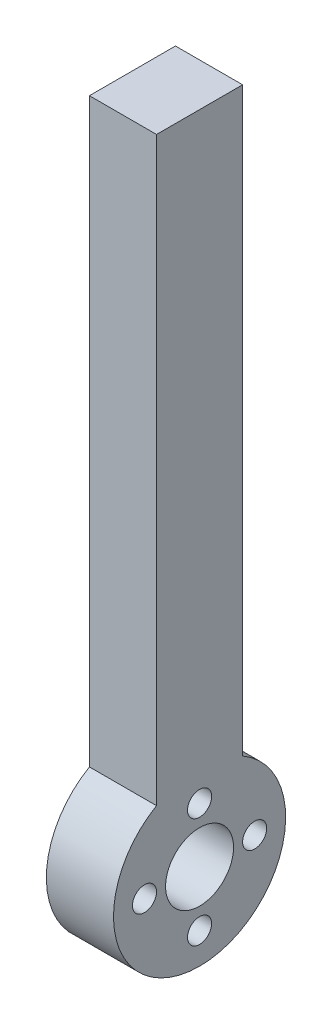
ISO-10303-21;
HEADER;
FILE_DESCRIPTION(('STEP AP214'),'2;1');
FILE_NAME('part.step','',(''),(''),'','','');
FILE_SCHEMA(('AUTOMOTIVE_DESIGN { 1 0 10303 214 1 1 1 1 }'));
ENDSEC;
DATA;
#1=APPLICATION_CONTEXT('core data for automotive mechanical design processes');
#2=APPLICATION_PROTOCOL_DEFINITION('international standard','automotive_design',2000,#1);
#3=PRODUCT_CONTEXT('',#1,'mechanical');
#4=PRODUCT('Part','Part','',(#3));
#5=PRODUCT_RELATED_PRODUCT_CATEGORY('part','',(#4));
#6=PRODUCT_DEFINITION_FORMATION('','',#4);
#7=PRODUCT_DEFINITION_CONTEXT('part definition',#1,'design');
#8=PRODUCT_DEFINITION('design','',#6,#7);
#9=PRODUCT_DEFINITION_SHAPE('','',#8);
#10=(LENGTH_UNIT() NAMED_UNIT(*) SI_UNIT(.MILLI.,.METRE.));
#11=(NAMED_UNIT(*) PLANE_ANGLE_UNIT() SI_UNIT($,.RADIAN.));
#12=(NAMED_UNIT(*) SI_UNIT($,.STERADIAN.) SOLID_ANGLE_UNIT());
#13=UNCERTAINTY_MEASURE_WITH_UNIT(LENGTH_MEASURE(1.E-05),#10,'distance_accuracy_value','');
#14=(GEOMETRIC_REPRESENTATION_CONTEXT(3) GLOBAL_UNCERTAINTY_ASSIGNED_CONTEXT((#13)) GLOBAL_UNIT_ASSIGNED_CONTEXT((#10,
#11,#12)) REPRESENTATION_CONTEXT('',''));
#15=CARTESIAN_POINT('',(0.,0.,0.));
#16=DIRECTION('',(0.,0.,1.));
#17=DIRECTION('',(1.,0.,0.));
#18=AXIS2_PLACEMENT_3D('',#15,#16,#17);
#19=CARTESIAN_POINT('',(9.906,-45.9740000480624,0.));
#20=DIRECTION('',(1.,0.,0.));
#21=DIRECTION('',(0.,0.,-1.));
#22=AXIS2_PLACEMENT_3D('',#19,#20,#21);
#23=PLANE('',#22);
#24=CARTESIAN_POINT('',(9.906,-45.9740000480624,-8.128));
#25=DIRECTION('',(1.,0.,0.));
#26=DIRECTION('',(0.,0.,-1.));
#27=AXIS2_PLACEMENT_3D('',#24,#25,#26);
#28=CIRCLE('',#27,1.778);
#29=CARTESIAN_POINT('',(9.906,-45.9740000480624,-9.90600000000001));
#30=VERTEX_POINT('',#29);
#31=EDGE_CURVE('E130',#30,#30,#28,.T.);
#32=ORIENTED_EDGE('',*,*,#31,.F.);
#33=EDGE_LOOP('',(#32));
#34=FACE_BOUND('',#33,.T.);
#35=CARTESIAN_POINT('',(9.906,-45.9740000480624,8.128));
#36=DIRECTION('',(1.,0.,0.));
#37=DIRECTION('',(0.,0.,-1.));
#38=AXIS2_PLACEMENT_3D('',#35,#36,#37);
#39=CIRCLE('',#38,1.778);
#40=CARTESIAN_POINT('',(9.906,-45.9740000480624,6.35));
#41=VERTEX_POINT('',#40);
#42=EDGE_CURVE('E118',#41,#41,#39,.T.);
#43=ORIENTED_EDGE('',*,*,#42,.F.);
#44=EDGE_LOOP('',(#43));
#45=FACE_BOUND('',#44,.T.);
#46=DIRECTION('',(0.,1.,0.));
#47=VECTOR('',#46,1.);
#48=CARTESIAN_POINT('',(9.906,-34.97547742,-6.35));
#49=LINE('',#48,#47);
#50=CARTESIAN_POINT('',(9.906,-34.97547742,-6.35000000000001));
#51=VERTEX_POINT('',#50);
#52=CARTESIAN_POINT('',(9.906,50.8,-6.35));
#53=VERTEX_POINT('',#52);
#54=EDGE_CURVE('E88',#51,#53,#49,.T.);
#55=ORIENTED_EDGE('',*,*,#54,.T.);
#56=DIRECTION('',(0.,0.,1.));
#57=VECTOR('',#56,1.);
#58=CARTESIAN_POINT('',(9.906,50.8,6.35));
#59=LINE('',#58,#57);
#60=CARTESIAN_POINT('',(9.906,50.8,6.35));
#61=VERTEX_POINT('',#60);
#62=EDGE_CURVE('E83',#53,#61,#59,.T.);
#63=ORIENTED_EDGE('',*,*,#62,.T.);
#64=DIRECTION('',(0.,-1.,0.));
#65=VECTOR('',#64,1.);
#66=CARTESIAN_POINT('',(9.906,-34.97547742,6.35));
#67=LINE('',#66,#65);
#68=CARTESIAN_POINT('',(9.906,-34.97547742,6.35));
#69=VERTEX_POINT('',#68);
#70=EDGE_CURVE('E86',#61,#69,#67,.T.);
#71=ORIENTED_EDGE('',*,*,#70,.T.);
#72=CARTESIAN_POINT('',(9.906,-45.9740000480624,0.));
#73=DIRECTION('',(1.,0.,0.));
#74=DIRECTION('',(0.,0.,-1.));
#75=AXIS2_PLACEMENT_3D('',#72,#73,#74);
#76=CIRCLE('',#75,12.7);
#77=EDGE_CURVE('E53',#69,#51,#76,.T.);
#78=ORIENTED_EDGE('',*,*,#77,.T.);
#79=EDGE_LOOP('',(#55,#63,#71,#78));
#80=FACE_BOUND('',#79,.T.);
#81=CARTESIAN_POINT('',(9.906,-45.9740000480624,0.));
#82=DIRECTION('',(1.,0.,0.));
#83=DIRECTION('',(0.,0.,-1.));
#84=AXIS2_PLACEMENT_3D('',#81,#82,#83);
#85=CIRCLE('',#84,5.0165);
#86=CARTESIAN_POINT('',(9.906,-45.9740000480624,-5.0165));
#87=VERTEX_POINT('',#86);
#88=EDGE_CURVE('E103',#87,#87,#85,.T.);
#89=ORIENTED_EDGE('',*,*,#88,.F.);
#90=EDGE_LOOP('',(#89));
#91=FACE_BOUND('',#90,.T.);
#92=CARTESIAN_POINT('',(9.906,-37.8460000480624,0.));
#93=DIRECTION('',(1.,0.,0.));
#94=DIRECTION('',(0.,0.,-1.));
#95=AXIS2_PLACEMENT_3D('',#92,#93,#94);
#96=CIRCLE('',#95,1.77800000000001);
#97=CARTESIAN_POINT('',(9.906,-37.8460000480624,-1.77800000000001));
#98=VERTEX_POINT('',#97);
#99=EDGE_CURVE('E124',#98,#98,#96,.T.);
#100=ORIENTED_EDGE('',*,*,#99,.F.);
#101=EDGE_LOOP('',(#100));
#102=FACE_BOUND('',#101,.T.);
#103=CARTESIAN_POINT('',(9.906,-54.1020000480624,0.));
#104=DIRECTION('',(1.,0.,0.));
#105=DIRECTION('',(0.,0.,-1.));
#106=AXIS2_PLACEMENT_3D('',#103,#104,#105);
#107=CIRCLE('',#106,1.778);
#108=CARTESIAN_POINT('',(9.906,-54.1020000480624,-1.77800000000001));
#109=VERTEX_POINT('',#108);
#110=EDGE_CURVE('E136',#109,#109,#107,.T.);
#111=ORIENTED_EDGE('',*,*,#110,.F.);
#112=EDGE_LOOP('',(#111));
#113=FACE_BOUND('',#112,.T.);
#114=ADVANCED_FACE('F36',(#34,#45,#80,#91,#102,#113),#23,.T.);
#115=CARTESIAN_POINT('',(0.,-45.9740000480624,0.));
#116=DIRECTION('',(1.,0.,0.));
#117=DIRECTION('',(0.,0.,-1.));
#118=AXIS2_PLACEMENT_3D('',#115,#116,#117);
#119=PLANE('',#118);
#120=DIRECTION('',(0.,1.,0.));
#121=VECTOR('',#120,1.);
#122=CARTESIAN_POINT('',(0.,-34.97547742,-6.35));
#123=LINE('',#122,#121);
#124=CARTESIAN_POINT('',(0.,-34.97547742,-6.35000000000001));
#125=VERTEX_POINT('',#124);
#126=CARTESIAN_POINT('',(0.,50.8,-6.35));
#127=VERTEX_POINT('',#126);
#128=EDGE_CURVE('E100',#125,#127,#123,.T.);
#129=ORIENTED_EDGE('',*,*,#128,.F.);
#130=CARTESIAN_POINT('',(0.,-45.9740000480624,0.));
#131=DIRECTION('',(1.,0.,0.));
#132=DIRECTION('',(0.,0.,-1.));
#133=AXIS2_PLACEMENT_3D('',#130,#131,#132);
#134=CIRCLE('',#133,12.7);
#135=CARTESIAN_POINT('',(0.,-34.97547742,6.35));
#136=VERTEX_POINT('',#135);
#137=EDGE_CURVE('E76',#136,#125,#134,.T.);
#138=ORIENTED_EDGE('',*,*,#137,.F.);
#139=DIRECTION('',(0.,-1.,0.));
#140=VECTOR('',#139,1.);
#141=CARTESIAN_POINT('',(0.,-34.97547742,6.35));
#142=LINE('',#141,#140);
#143=CARTESIAN_POINT('',(0.,50.8,6.35));
#144=VERTEX_POINT('',#143);
#145=EDGE_CURVE('E70',#144,#136,#142,.T.);
#146=ORIENTED_EDGE('',*,*,#145,.F.);
#147=DIRECTION('',(0.,0.,1.));
#148=VECTOR('',#147,1.);
#149=CARTESIAN_POINT('',(0.,50.8,6.35));
#150=LINE('',#149,#148);
#151=EDGE_CURVE('E92',#127,#144,#150,.T.);
#152=ORIENTED_EDGE('',*,*,#151,.F.);
#153=EDGE_LOOP('',(#129,#138,#146,#152));
#154=FACE_BOUND('',#153,.T.);
#155=CARTESIAN_POINT('',(0.,-45.9740000480624,0.));
#156=DIRECTION('',(1.,0.,0.));
#157=DIRECTION('',(0.,0.,-1.));
#158=AXIS2_PLACEMENT_3D('',#155,#156,#157);
#159=CIRCLE('',#158,5.0165);
#160=CARTESIAN_POINT('',(0.,-45.9740000480624,-5.0165));
#161=VERTEX_POINT('',#160);
#162=EDGE_CURVE('E115',#161,#161,#159,.T.);
#163=ORIENTED_EDGE('',*,*,#162,.T.);
#164=EDGE_LOOP('',(#163));
#165=FACE_BOUND('',#164,.T.);
#166=CARTESIAN_POINT('',(0.,-45.9740000480624,8.128));
#167=DIRECTION('',(1.,0.,0.));
#168=DIRECTION('',(0.,0.,-1.));
#169=AXIS2_PLACEMENT_3D('',#166,#167,#168);
#170=CIRCLE('',#169,1.778);
#171=CARTESIAN_POINT('',(0.,-45.9740000480624,6.35));
#172=VERTEX_POINT('',#171);
#173=EDGE_CURVE('E121',#172,#172,#170,.T.);
#174=ORIENTED_EDGE('',*,*,#173,.T.);
#175=EDGE_LOOP('',(#174));
#176=FACE_BOUND('',#175,.T.);
#177=CARTESIAN_POINT('',(0.,-37.8460000480624,0.));
#178=DIRECTION('',(1.,0.,0.));
#179=DIRECTION('',(0.,0.,-1.));
#180=AXIS2_PLACEMENT_3D('',#177,#178,#179);
#181=CIRCLE('',#180,1.77800000000001);
#182=CARTESIAN_POINT('',(0.,-37.8460000480624,-1.77800000000001));
#183=VERTEX_POINT('',#182);
#184=EDGE_CURVE('E127',#183,#183,#181,.T.);
#185=ORIENTED_EDGE('',*,*,#184,.T.);
#186=EDGE_LOOP('',(#185));
#187=FACE_BOUND('',#186,.T.);
#188=CARTESIAN_POINT('',(0.,-45.9740000480624,-8.128));
#189=DIRECTION('',(1.,0.,0.));
#190=DIRECTION('',(0.,0.,-1.));
#191=AXIS2_PLACEMENT_3D('',#188,#189,#190);
#192=CIRCLE('',#191,1.778);
#193=CARTESIAN_POINT('',(0.,-45.9740000480624,-9.90600000000001));
#194=VERTEX_POINT('',#193);
#195=EDGE_CURVE('E133',#194,#194,#192,.T.);
#196=ORIENTED_EDGE('',*,*,#195,.T.);
#197=EDGE_LOOP('',(#196));
#198=FACE_BOUND('',#197,.T.);
#199=CARTESIAN_POINT('',(0.,-54.1020000480624,0.));
#200=DIRECTION('',(1.,0.,0.));
#201=DIRECTION('',(0.,0.,-1.));
#202=AXIS2_PLACEMENT_3D('',#199,#200,#201);
#203=CIRCLE('',#202,1.778);
#204=CARTESIAN_POINT('',(0.,-54.1020000480624,-1.77800000000001));
#205=VERTEX_POINT('',#204);
#206=EDGE_CURVE('E139',#205,#205,#203,.T.);
#207=ORIENTED_EDGE('',*,*,#206,.T.);
#208=EDGE_LOOP('',(#207));
#209=FACE_BOUND('',#208,.T.);
#210=ADVANCED_FACE('F111',(#154,#165,#176,#187,#198,#209),#119,.F.);
#211=CARTESIAN_POINT('',(9.906,-34.97547742,-6.35));
#212=DIRECTION('',(0.,0.,1.));
#213=DIRECTION('',(0.,-1.,0.));
#214=AXIS2_PLACEMENT_3D('',#211,#212,#213);
#215=PLANE('',#214);
#216=ORIENTED_EDGE('',*,*,#128,.T.);
#217=DIRECTION('',(-1.,0.,0.));
#218=VECTOR('',#217,1.);
#219=CARTESIAN_POINT('',(9.906,50.8,-6.35));
#220=LINE('',#219,#218);
#221=EDGE_CURVE('E11',#53,#127,#220,.T.);
#222=ORIENTED_EDGE('',*,*,#221,.F.);
#223=ORIENTED_EDGE('',*,*,#54,.F.);
#224=DIRECTION('',(-1.,0.,0.));
#225=VECTOR('',#224,1.);
#226=CARTESIAN_POINT('',(9.906,-34.97547742,-6.35000000000001));
#227=LINE('',#226,#225);
#228=EDGE_CURVE('E96',#51,#125,#227,.T.);
#229=ORIENTED_EDGE('',*,*,#228,.T.);
#230=EDGE_LOOP('',(#216,#222,#223,#229));
#231=FACE_BOUND('',#230,.T.);
#232=ADVANCED_FACE('F38',(#231),#215,.F.);
#233=CARTESIAN_POINT('',(9.906,50.8,6.35));
#234=DIRECTION('',(0.,-1.,0.));
#235=DIRECTION('',(0.,0.,-1.));
#236=AXIS2_PLACEMENT_3D('',#233,#234,#235);
#237=PLANE('',#236);
#238=ORIENTED_EDGE('',*,*,#151,.T.);
#239=DIRECTION('',(-1.,0.,0.));
#240=VECTOR('',#239,1.);
#241=CARTESIAN_POINT('',(9.906,50.8,6.35));
#242=LINE('',#241,#240);
#243=EDGE_CURVE('E45',#61,#144,#242,.T.);
#244=ORIENTED_EDGE('',*,*,#243,.F.);
#245=ORIENTED_EDGE('',*,*,#62,.F.);
#246=ORIENTED_EDGE('',*,*,#221,.T.);
#247=EDGE_LOOP('',(#238,#244,#245,#246));
#248=FACE_BOUND('',#247,.T.);
#249=ADVANCED_FACE('F91',(#248),#237,.F.);
#250=CARTESIAN_POINT('',(9.906,-34.97547742,6.35));
#251=DIRECTION('',(0.,0.,-1.));
#252=DIRECTION('',(-1.,0.,0.));
#253=AXIS2_PLACEMENT_3D('',#250,#251,#252);
#254=PLANE('',#253);
#255=ORIENTED_EDGE('',*,*,#145,.T.);
#256=DIRECTION('',(-1.,0.,0.));
#257=VECTOR('',#256,1.);
#258=CARTESIAN_POINT('',(9.906,-34.97547742,6.35));
#259=LINE('',#258,#257);
#260=EDGE_CURVE('E93',#69,#136,#259,.T.);
#261=ORIENTED_EDGE('',*,*,#260,.F.);
#262=ORIENTED_EDGE('',*,*,#70,.F.);
#263=ORIENTED_EDGE('',*,*,#243,.T.);
#264=EDGE_LOOP('',(#255,#261,#262,#263));
#265=FACE_BOUND('',#264,.T.);
#266=ADVANCED_FACE('F94',(#265),#254,.F.);
#267=CARTESIAN_POINT('',(9.906,-45.9740000480624,0.));
#268=DIRECTION('',(-1.,0.,0.));
#269=DIRECTION('',(0.,0.,1.));
#270=AXIS2_PLACEMENT_3D('',#267,#268,#269);
#271=CYLINDRICAL_SURFACE('',#270,12.7);
#272=ORIENTED_EDGE('',*,*,#137,.T.);
#273=ORIENTED_EDGE('',*,*,#228,.F.);
#274=ORIENTED_EDGE('',*,*,#77,.F.);
#275=ORIENTED_EDGE('',*,*,#260,.T.);
#276=EDGE_LOOP('',(#272,#273,#274,#275));
#277=FACE_BOUND('',#276,.T.);
#278=ADVANCED_FACE('F108',(#277),#271,.T.);
#279=CARTESIAN_POINT('',(9.906,-45.9740000480624,0.));
#280=DIRECTION('',(-1.,0.,0.));
#281=DIRECTION('',(0.,0.,1.));
#282=AXIS2_PLACEMENT_3D('',#279,#280,#281);
#283=CYLINDRICAL_SURFACE('',#282,5.0165);
#284=ORIENTED_EDGE('',*,*,#88,.T.);
#285=EDGE_LOOP('',(#284));
#286=FACE_BOUND('',#285,.T.);
#287=ORIENTED_EDGE('',*,*,#162,.F.);
#288=EDGE_LOOP('',(#287));
#289=FACE_BOUND('',#288,.T.);
#290=ADVANCED_FACE('F158',(#286,#289),#283,.F.);
#291=CARTESIAN_POINT('',(9.906,-45.9740000480624,8.128));
#292=DIRECTION('',(-1.,0.,0.));
#293=DIRECTION('',(0.,0.,1.));
#294=AXIS2_PLACEMENT_3D('',#291,#292,#293);
#295=CYLINDRICAL_SURFACE('',#294,1.778);
#296=ORIENTED_EDGE('',*,*,#42,.T.);
#297=EDGE_LOOP('',(#296));
#298=FACE_BOUND('',#297,.T.);
#299=ORIENTED_EDGE('',*,*,#173,.F.);
#300=EDGE_LOOP('',(#299));
#301=FACE_BOUND('',#300,.T.);
#302=ADVANCED_FACE('F212',(#298,#301),#295,.F.);
#303=CARTESIAN_POINT('',(9.906,-37.8460000480624,0.));
#304=DIRECTION('',(-1.,0.,0.));
#305=DIRECTION('',(0.,0.,1.));
#306=AXIS2_PLACEMENT_3D('',#303,#304,#305);
#307=CYLINDRICAL_SURFACE('',#306,1.77800000000001);
#308=ORIENTED_EDGE('',*,*,#99,.T.);
#309=EDGE_LOOP('',(#308));
#310=FACE_BOUND('',#309,.T.);
#311=ORIENTED_EDGE('',*,*,#184,.F.);
#312=EDGE_LOOP('',(#311));
#313=FACE_BOUND('',#312,.T.);
#314=ADVANCED_FACE('F221',(#310,#313),#307,.F.);
#315=CARTESIAN_POINT('',(9.906,-45.9740000480624,-8.128));
#316=DIRECTION('',(-1.,0.,0.));
#317=DIRECTION('',(0.,0.,1.));
#318=AXIS2_PLACEMENT_3D('',#315,#316,#317);
#319=CYLINDRICAL_SURFACE('',#318,1.778);
#320=ORIENTED_EDGE('',*,*,#31,.T.);
#321=EDGE_LOOP('',(#320));
#322=FACE_BOUND('',#321,.T.);
#323=ORIENTED_EDGE('',*,*,#195,.F.);
#324=EDGE_LOOP('',(#323));
#325=FACE_BOUND('',#324,.T.);
#326=ADVANCED_FACE('F230',(#322,#325),#319,.F.);
#327=CARTESIAN_POINT('',(9.906,-54.1020000480624,0.));
#328=DIRECTION('',(-1.,0.,0.));
#329=DIRECTION('',(0.,0.,1.));
#330=AXIS2_PLACEMENT_3D('',#327,#328,#329);
#331=CYLINDRICAL_SURFACE('',#330,1.778);
#332=ORIENTED_EDGE('',*,*,#110,.T.);
#333=EDGE_LOOP('',(#332));
#334=FACE_BOUND('',#333,.T.);
#335=ORIENTED_EDGE('',*,*,#206,.F.);
#336=EDGE_LOOP('',(#335));
#337=FACE_BOUND('',#336,.T.);
#338=ADVANCED_FACE('F145',(#334,#337),#331,.F.);
#339=CLOSED_SHELL('',(#114,#210,#232,#249,#266,#278,#290,#302,#314,#326,#338));
#340=MANIFOLD_SOLID_BREP('B2',#339);
#341=ADVANCED_BREP_SHAPE_REPRESENTATION('',(#18,#340),#14);
#342=SHAPE_DEFINITION_REPRESENTATION(#9,#341);
ENDSEC;
END-ISO-10303-21;
